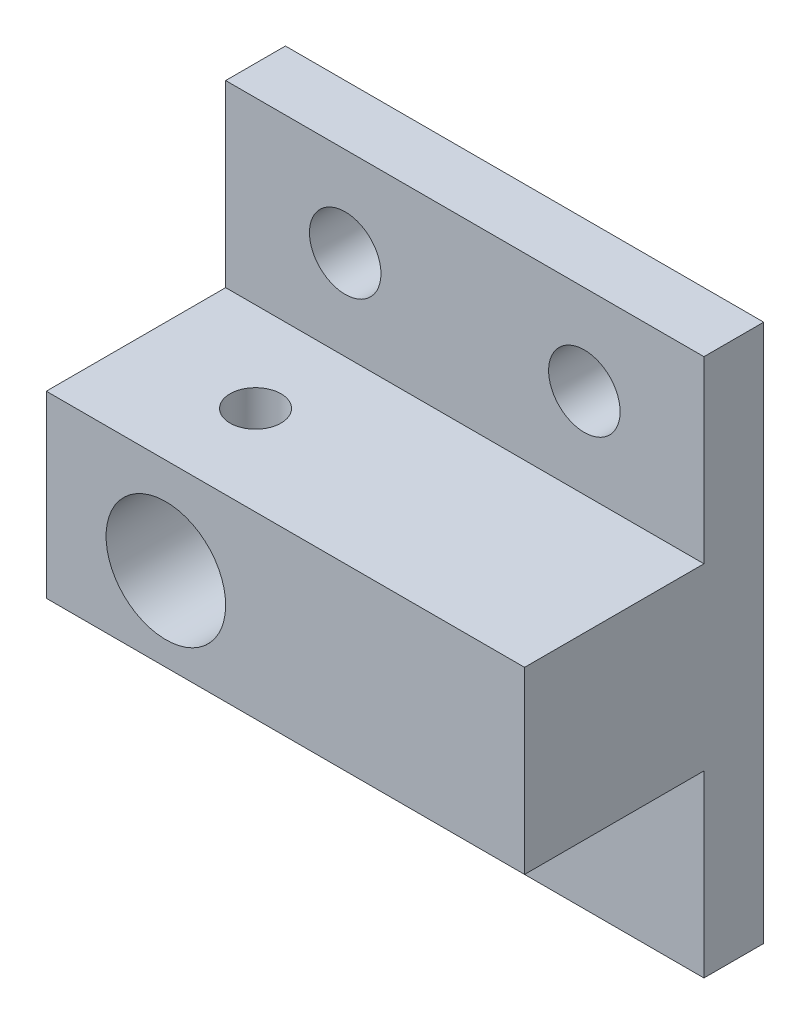
ISO-10303-21;
HEADER;
FILE_DESCRIPTION(('STEP AP214'),'2;1');
FILE_NAME('part.step','',(''),(''),'','','');
FILE_SCHEMA(('AUTOMOTIVE_DESIGN { 1 0 10303 214 1 1 1 1 }'));
ENDSEC;
DATA;
#1=APPLICATION_CONTEXT('core data for automotive mechanical design processes');
#2=APPLICATION_PROTOCOL_DEFINITION('international standard','automotive_design',2000,#1);
#3=PRODUCT_CONTEXT('',#1,'mechanical');
#4=PRODUCT('Part','Part','',(#3));
#5=PRODUCT_RELATED_PRODUCT_CATEGORY('part','',(#4));
#6=PRODUCT_DEFINITION_FORMATION('','',#4);
#7=PRODUCT_DEFINITION_CONTEXT('part definition',#1,'design');
#8=PRODUCT_DEFINITION('design','',#6,#7);
#9=PRODUCT_DEFINITION_SHAPE('','',#8);
#10=(LENGTH_UNIT() NAMED_UNIT(*) SI_UNIT(.MILLI.,.METRE.));
#11=(NAMED_UNIT(*) PLANE_ANGLE_UNIT() SI_UNIT($,.RADIAN.));
#12=(NAMED_UNIT(*) SI_UNIT($,.STERADIAN.) SOLID_ANGLE_UNIT());
#13=UNCERTAINTY_MEASURE_WITH_UNIT(LENGTH_MEASURE(1.E-05),#10,'distance_accuracy_value','');
#14=(GEOMETRIC_REPRESENTATION_CONTEXT(3) GLOBAL_UNCERTAINTY_ASSIGNED_CONTEXT((#13)) GLOBAL_UNIT_ASSIGNED_CONTEXT((#10,
#11,#12)) REPRESENTATION_CONTEXT('',''));
#15=CARTESIAN_POINT('',(0.,0.,0.));
#16=DIRECTION('',(0.,0.,1.));
#17=DIRECTION('',(1.,0.,0.));
#18=AXIS2_PLACEMENT_3D('',#15,#16,#17);
#19=CARTESIAN_POINT('',(12.7,-14.2874999999999,12.7));
#20=DIRECTION('',(-1.,0.,0.));
#21=DIRECTION('',(0.,0.,1.));
#22=AXIS2_PLACEMENT_3D('',#19,#20,#21);
#23=PLANE('',#22);
#24=DIRECTION('',(0.,0.,1.));
#25=VECTOR('',#24,1.);
#26=CARTESIAN_POINT('',(12.7,-4.7625,3.17499999999998));
#27=LINE('',#26,#25);
#28=CARTESIAN_POINT('',(12.7,-4.7625,3.17499999999998));
#29=VERTEX_POINT('',#28);
#30=CARTESIAN_POINT('',(12.7,-4.76249999999989,12.7));
#31=VERTEX_POINT('',#30);
#32=EDGE_CURVE('E60',#29,#31,#27,.T.);
#33=ORIENTED_EDGE('',*,*,#32,.F.);
#34=DIRECTION('',(0.,1.,0.));
#35=VECTOR('',#34,1.);
#36=CARTESIAN_POINT('',(12.7,0.,3.17500000000001));
#37=LINE('',#36,#35);
#38=CARTESIAN_POINT('',(12.7,-14.2875,3.17499999999998));
#39=VERTEX_POINT('',#38);
#40=EDGE_CURVE('E110',#39,#29,#37,.T.);
#41=ORIENTED_EDGE('',*,*,#40,.F.);
#42=DIRECTION('',(0.,0.,-1.));
#43=VECTOR('',#42,1.);
#44=CARTESIAN_POINT('',(12.7,-14.2874999999999,12.7));
#45=LINE('',#44,#43);
#46=CARTESIAN_POINT('',(12.7,-14.2875,0.));
#47=VERTEX_POINT('',#46);
#48=EDGE_CURVE('E155',#39,#47,#45,.T.);
#49=ORIENTED_EDGE('',*,*,#48,.T.);
#50=DIRECTION('',(0.,1.,0.));
#51=VECTOR('',#50,1.);
#52=CARTESIAN_POINT('',(12.7,-14.2875,0.));
#53=LINE('',#52,#51);
#54=CARTESIAN_POINT('',(12.7,14.2875,0.));
#55=VERTEX_POINT('',#54);
#56=EDGE_CURVE('E130',#47,#55,#53,.T.);
#57=ORIENTED_EDGE('',*,*,#56,.T.);
#58=DIRECTION('',(0.,0.,-1.));
#59=VECTOR('',#58,1.);
#60=CARTESIAN_POINT('',(12.7,14.2875000000001,12.7));
#61=LINE('',#60,#59);
#62=CARTESIAN_POINT('',(12.7,14.2875,3.17500000000001));
#63=VERTEX_POINT('',#62);
#64=EDGE_CURVE('E11',#63,#55,#61,.T.);
#65=ORIENTED_EDGE('',*,*,#64,.F.);
#66=DIRECTION('',(0.,1.,0.));
#67=VECTOR('',#66,1.);
#68=CARTESIAN_POINT('',(12.7,4.7625,3.17500000000001));
#69=LINE('',#68,#67);
#70=CARTESIAN_POINT('',(12.7,4.7625,3.17500000000001));
#71=VERTEX_POINT('',#70);
#72=EDGE_CURVE('E142',#71,#63,#69,.T.);
#73=ORIENTED_EDGE('',*,*,#72,.F.);
#74=DIRECTION('',(0.,0.,1.));
#75=VECTOR('',#74,1.);
#76=CARTESIAN_POINT('',(12.7,4.7625,3.17500000000001));
#77=LINE('',#76,#75);
#78=CARTESIAN_POINT('',(12.7,4.76250000000009,12.7));
#79=VERTEX_POINT('',#78);
#80=EDGE_CURVE('E132',#71,#79,#77,.T.);
#81=ORIENTED_EDGE('',*,*,#80,.T.);
#82=DIRECTION('',(0.,1.,0.));
#83=VECTOR('',#82,1.);
#84=CARTESIAN_POINT('',(12.7,-14.2874999999999,12.7));
#85=LINE('',#84,#83);
#86=EDGE_CURVE('E149',#31,#79,#85,.T.);
#87=ORIENTED_EDGE('',*,*,#86,.F.);
#88=EDGE_LOOP('',(#33,#41,#49,#57,#65,#73,#81,#87));
#89=FACE_BOUND('',#88,.T.);
#90=ADVANCED_FACE('F38',(#89),#23,.F.);
#91=CARTESIAN_POINT('',(-12.7,-14.2875,12.7));
#92=DIRECTION('',(1.,0.,0.));
#93=DIRECTION('',(0.,0.,-1.));
#94=AXIS2_PLACEMENT_3D('',#91,#92,#93);
#95=PLANE('',#94);
#96=DIRECTION('',(0.,0.,1.));
#97=VECTOR('',#96,1.);
#98=CARTESIAN_POINT('',(-12.7,-4.7625,3.17499999999998));
#99=LINE('',#98,#97);
#100=CARTESIAN_POINT('',(-12.7,-4.7625,3.17499999999998));
#101=VERTEX_POINT('',#100);
#102=CARTESIAN_POINT('',(-12.7,-4.7625,12.7));
#103=VERTEX_POINT('',#102);
#104=EDGE_CURVE('E100',#101,#103,#99,.T.);
#105=ORIENTED_EDGE('',*,*,#104,.T.);
#106=DIRECTION('',(0.,-1.,0.));
#107=VECTOR('',#106,1.);
#108=CARTESIAN_POINT('',(-12.7,-14.2875,12.7));
#109=LINE('',#108,#107);
#110=CARTESIAN_POINT('',(-12.7,4.7625,12.7));
#111=VERTEX_POINT('',#110);
#112=EDGE_CURVE('E152',#111,#103,#109,.T.);
#113=ORIENTED_EDGE('',*,*,#112,.F.);
#114=DIRECTION('',(0.,0.,1.));
#115=VECTOR('',#114,1.);
#116=CARTESIAN_POINT('',(-12.7,4.7625,3.17500000000001));
#117=LINE('',#116,#115);
#118=CARTESIAN_POINT('',(-12.7,4.7625,3.17500000000001));
#119=VERTEX_POINT('',#118);
#120=EDGE_CURVE('E52',#119,#111,#117,.T.);
#121=ORIENTED_EDGE('',*,*,#120,.F.);
#122=DIRECTION('',(0.,1.,0.));
#123=VECTOR('',#122,1.);
#124=CARTESIAN_POINT('',(-12.7,4.7625,3.17500000000001));
#125=LINE('',#124,#123);
#126=CARTESIAN_POINT('',(-12.7,14.2875,3.17500000000001));
#127=VERTEX_POINT('',#126);
#128=EDGE_CURVE('E139',#119,#127,#125,.T.);
#129=ORIENTED_EDGE('',*,*,#128,.T.);
#130=DIRECTION('',(0.,0.,-1.));
#131=VECTOR('',#130,1.);
#132=CARTESIAN_POINT('',(-12.7,14.2875,12.7));
#133=LINE('',#132,#131);
#134=CARTESIAN_POINT('',(-12.7,14.2874999999999,0.));
#135=VERTEX_POINT('',#134);
#136=EDGE_CURVE('E45',#127,#135,#133,.T.);
#137=ORIENTED_EDGE('',*,*,#136,.T.);
#138=DIRECTION('',(0.,-1.,0.));
#139=VECTOR('',#138,1.);
#140=CARTESIAN_POINT('',(-12.7,-14.2875000000001,0.));
#141=LINE('',#140,#139);
#142=CARTESIAN_POINT('',(-12.7,-14.2875000000001,0.));
#143=VERTEX_POINT('',#142);
#144=EDGE_CURVE('E161',#135,#143,#141,.T.);
#145=ORIENTED_EDGE('',*,*,#144,.T.);
#146=DIRECTION('',(0.,0.,-1.));
#147=VECTOR('',#146,1.);
#148=CARTESIAN_POINT('',(-12.7,-14.2875,12.7));
#149=LINE('',#148,#147);
#150=CARTESIAN_POINT('',(-12.7,-14.2875,3.17499999999998));
#151=VERTEX_POINT('',#150);
#152=EDGE_CURVE('E121',#151,#143,#149,.T.);
#153=ORIENTED_EDGE('',*,*,#152,.F.);
#154=DIRECTION('',(0.,-1.,0.));
#155=VECTOR('',#154,1.);
#156=CARTESIAN_POINT('',(-12.7,0.,3.17500000000001));
#157=LINE('',#156,#155);
#158=EDGE_CURVE('E114',#101,#151,#157,.T.);
#159=ORIENTED_EDGE('',*,*,#158,.F.);
#160=EDGE_LOOP('',(#105,#113,#121,#129,#137,#145,#153,#159));
#161=FACE_BOUND('',#160,.T.);
#162=ADVANCED_FACE('F119',(#161),#95,.F.);
#163=CARTESIAN_POINT('',(-12.7,-14.2875,12.7));
#164=DIRECTION('',(0.,1.,0.));
#165=DIRECTION('',(0.,0.,1.));
#166=AXIS2_PLACEMENT_3D('',#163,#164,#165);
#167=PLANE('',#166);
#168=DIRECTION('',(1.,0.,0.));
#169=VECTOR('',#168,1.);
#170=CARTESIAN_POINT('',(0.,-14.2875,3.17499999999998));
#171=LINE('',#170,#169);
#172=EDGE_CURVE('E122',#151,#39,#171,.T.);
#173=ORIENTED_EDGE('',*,*,#172,.F.);
#174=ORIENTED_EDGE('',*,*,#152,.T.);
#175=DIRECTION('',(1.,0.,0.));
#176=VECTOR('',#175,1.);
#177=CARTESIAN_POINT('',(-12.7,-14.2875000000001,0.));
#178=LINE('',#177,#176);
#179=EDGE_CURVE('E153',#143,#47,#178,.T.);
#180=ORIENTED_EDGE('',*,*,#179,.T.);
#181=ORIENTED_EDGE('',*,*,#48,.F.);
#182=EDGE_LOOP('',(#173,#174,#180,#181));
#183=FACE_BOUND('',#182,.T.);
#184=ADVANCED_FACE('F178',(#183),#167,.F.);
#185=CARTESIAN_POINT('',(0.,1.11022302462516E-13,12.7));
#186=DIRECTION('',(0.,0.,-1.));
#187=DIRECTION('',(-1.,0.,0.));
#188=AXIS2_PLACEMENT_3D('',#185,#186,#187);
#189=PLANE('',#188);
#190=CARTESIAN_POINT('',(-6.35,-0.317499999999998,12.7));
#191=DIRECTION('',(0.,0.,1.));
#192=DIRECTION('',(1.,0.,0.));
#193=AXIS2_PLACEMENT_3D('',#190,#191,#192);
#194=CIRCLE('',#193,3.175);
#195=CARTESIAN_POINT('',(-3.175,-0.317499999999998,12.7));
#196=VERTEX_POINT('',#195);
#197=EDGE_CURVE('E221',#196,#196,#194,.T.);
#198=ORIENTED_EDGE('',*,*,#197,.F.);
#199=EDGE_LOOP('',(#198));
#200=FACE_BOUND('',#199,.T.);
#201=DIRECTION('',(1.,0.,0.));
#202=VECTOR('',#201,1.);
#203=CARTESIAN_POINT('',(0.,-4.76249999999989,12.7));
#204=LINE('',#203,#202);
#205=EDGE_CURVE('E105',#103,#31,#204,.T.);
#206=ORIENTED_EDGE('',*,*,#205,.T.);
#207=ORIENTED_EDGE('',*,*,#86,.T.);
#208=DIRECTION('',(1.,0.,0.));
#209=VECTOR('',#208,1.);
#210=CARTESIAN_POINT('',(-12.7,4.7625,12.7));
#211=LINE('',#210,#209);
#212=EDGE_CURVE('E129',#111,#79,#211,.T.);
#213=ORIENTED_EDGE('',*,*,#212,.F.);
#214=ORIENTED_EDGE('',*,*,#112,.T.);
#215=EDGE_LOOP('',(#206,#207,#213,#214));
#216=FACE_BOUND('',#215,.T.);
#217=ADVANCED_FACE('F183',(#200,#216),#189,.F.);
#218=CARTESIAN_POINT('',(-12.7,14.2875,12.7));
#219=DIRECTION('',(0.,-1.,0.));
#220=DIRECTION('',(0.,0.,-1.));
#221=AXIS2_PLACEMENT_3D('',#218,#219,#220);
#222=PLANE('',#221);
#223=ORIENTED_EDGE('',*,*,#136,.F.);
#224=DIRECTION('',(1.,0.,0.));
#225=VECTOR('',#224,1.);
#226=CARTESIAN_POINT('',(-12.7,14.2875,3.17500000000001));
#227=LINE('',#226,#225);
#228=EDGE_CURVE('E144',#127,#63,#227,.T.);
#229=ORIENTED_EDGE('',*,*,#228,.T.);
#230=ORIENTED_EDGE('',*,*,#64,.T.);
#231=DIRECTION('',(-1.,0.,0.));
#232=VECTOR('',#231,1.);
#233=CARTESIAN_POINT('',(-12.7,14.2874999999999,0.));
#234=LINE('',#233,#232);
#235=EDGE_CURVE('E158',#55,#135,#234,.T.);
#236=ORIENTED_EDGE('',*,*,#235,.T.);
#237=EDGE_LOOP('',(#223,#229,#230,#236));
#238=FACE_BOUND('',#237,.T.);
#239=ADVANCED_FACE('F171',(#238),#222,.F.);
#240=CARTESIAN_POINT('',(0.,0.,0.));
#241=DIRECTION('',(0.,0.,-1.));
#242=DIRECTION('',(-1.,0.,0.));
#243=AXIS2_PLACEMENT_3D('',#240,#241,#242);
#244=PLANE('',#243);
#245=CARTESIAN_POINT('',(-6.34999999999999,9.52500000000001,0.));
#246=DIRECTION('',(0.,0.,-1.));
#247=DIRECTION('',(-1.,0.,0.));
#248=AXIS2_PLACEMENT_3D('',#245,#246,#247);
#249=CIRCLE('',#248,1.89865);
#250=CARTESIAN_POINT('',(-8.24864999999999,9.52500000000001,0.));
#251=VERTEX_POINT('',#250);
#252=EDGE_CURVE('E262',#251,#251,#249,.T.);
#253=ORIENTED_EDGE('',*,*,#252,.F.);
#254=EDGE_LOOP('',(#253));
#255=FACE_BOUND('',#254,.T.);
#256=CARTESIAN_POINT('',(6.35000000000001,9.5249999999999,0.));
#257=DIRECTION('',(0.,0.,-1.));
#258=DIRECTION('',(-1.,0.,0.));
#259=AXIS2_PLACEMENT_3D('',#256,#257,#258);
#260=CIRCLE('',#259,1.89865);
#261=CARTESIAN_POINT('',(4.45135000000001,9.5249999999999,0.));
#262=VERTEX_POINT('',#261);
#263=EDGE_CURVE('E266',#262,#262,#260,.T.);
#264=ORIENTED_EDGE('',*,*,#263,.F.);
#265=EDGE_LOOP('',(#264));
#266=FACE_BOUND('',#265,.T.);
#267=CARTESIAN_POINT('',(-6.35,-8.57250000000001,1.11022302462516E-13));
#268=DIRECTION('',(0.,0.,-1.));
#269=DIRECTION('',(-1.,0.,0.));
#270=AXIS2_PLACEMENT_3D('',#267,#268,#269);
#271=CIRCLE('',#270,1.89865);
#272=CARTESIAN_POINT('',(-8.24865,-8.57250000000001,1.11022302462516E-13));
#273=VERTEX_POINT('',#272);
#274=EDGE_CURVE('E274',#273,#273,#271,.T.);
#275=ORIENTED_EDGE('',*,*,#274,.F.);
#276=EDGE_LOOP('',(#275));
#277=FACE_BOUND('',#276,.T.);
#278=CARTESIAN_POINT('',(-6.35,-0.317499999999998,0.));
#279=DIRECTION('',(0.,0.,1.));
#280=DIRECTION('',(1.,0.,0.));
#281=AXIS2_PLACEMENT_3D('',#278,#279,#280);
#282=CIRCLE('',#281,3.175);
#283=CARTESIAN_POINT('',(-3.175,-0.317499999999998,0.));
#284=VERTEX_POINT('',#283);
#285=EDGE_CURVE('E135',#284,#284,#282,.T.);
#286=ORIENTED_EDGE('',*,*,#285,.T.);
#287=EDGE_LOOP('',(#286));
#288=FACE_BOUND('',#287,.T.);
#289=ORIENTED_EDGE('',*,*,#56,.F.);
#290=ORIENTED_EDGE('',*,*,#179,.F.);
#291=ORIENTED_EDGE('',*,*,#144,.F.);
#292=ORIENTED_EDGE('',*,*,#235,.F.);
#293=EDGE_LOOP('',(#289,#290,#291,#292));
#294=FACE_BOUND('',#293,.T.);
#295=ADVANCED_FACE('F175',(#255,#266,#277,#288,#294),#244,.T.);
#296=CARTESIAN_POINT('',(-12.7,4.7625,3.17500000000001));
#297=DIRECTION('',(0.,-1.,0.));
#298=DIRECTION('',(0.,0.,-1.));
#299=AXIS2_PLACEMENT_3D('',#296,#297,#298);
#300=PLANE('',#299);
#301=CARTESIAN_POINT('',(-6.34999999999997,4.7625,7.93750000000001));
#302=DIRECTION('',(0.,1.,0.));
#303=DIRECTION('',(0.,0.,1.));
#304=AXIS2_PLACEMENT_3D('',#301,#302,#303);
#305=CIRCLE('',#304,1.35255);
#306=CARTESIAN_POINT('',(-6.34999999999997,4.7625,9.29005000000001));
#307=VERTEX_POINT('',#306);
#308=EDGE_CURVE('E227',#307,#307,#305,.T.);
#309=ORIENTED_EDGE('',*,*,#308,.F.);
#310=EDGE_LOOP('',(#309));
#311=FACE_BOUND('',#310,.T.);
#312=ORIENTED_EDGE('',*,*,#212,.T.);
#313=ORIENTED_EDGE('',*,*,#80,.F.);
#314=DIRECTION('',(1.,0.,0.));
#315=VECTOR('',#314,1.);
#316=CARTESIAN_POINT('',(-12.7,4.7625,3.17500000000001));
#317=LINE('',#316,#315);
#318=EDGE_CURVE('E137',#119,#71,#317,.T.);
#319=ORIENTED_EDGE('',*,*,#318,.F.);
#320=ORIENTED_EDGE('',*,*,#120,.T.);
#321=EDGE_LOOP('',(#312,#313,#319,#320));
#322=FACE_BOUND('',#321,.T.);
#323=ADVANCED_FACE('F184',(#311,#322),#300,.F.);
#324=CARTESIAN_POINT('',(0.,0.,3.17500000000001));
#325=DIRECTION('',(0.,0.,-1.));
#326=DIRECTION('',(-1.,0.,0.));
#327=AXIS2_PLACEMENT_3D('',#324,#325,#326);
#328=PLANE('',#327);
#329=CARTESIAN_POINT('',(-6.34999999999999,9.52500000000001,3.17499999999998));
#330=DIRECTION('',(0.,0.,1.));
#331=DIRECTION('',(1.,0.,0.));
#332=AXIS2_PLACEMENT_3D('',#329,#330,#331);
#333=CIRCLE('',#332,1.89865);
#334=CARTESIAN_POINT('',(-4.45135,9.52500000000001,3.17499999999998));
#335=VERTEX_POINT('',#334);
#336=EDGE_CURVE('E259',#335,#335,#333,.T.);
#337=ORIENTED_EDGE('',*,*,#336,.F.);
#338=EDGE_LOOP('',(#337));
#339=FACE_BOUND('',#338,.T.);
#340=CARTESIAN_POINT('',(6.35000000000001,9.52500000000001,3.17499999999998));
#341=DIRECTION('',(0.,0.,1.));
#342=DIRECTION('',(1.,0.,0.));
#343=AXIS2_PLACEMENT_3D('',#340,#341,#342);
#344=CIRCLE('',#343,1.89865);
#345=CARTESIAN_POINT('',(8.24865000000001,9.52500000000001,3.17499999999998));
#346=VERTEX_POINT('',#345);
#347=EDGE_CURVE('E263',#346,#346,#344,.T.);
#348=ORIENTED_EDGE('',*,*,#347,.F.);
#349=EDGE_LOOP('',(#348));
#350=FACE_BOUND('',#349,.T.);
#351=ORIENTED_EDGE('',*,*,#128,.F.);
#352=ORIENTED_EDGE('',*,*,#318,.T.);
#353=ORIENTED_EDGE('',*,*,#72,.T.);
#354=ORIENTED_EDGE('',*,*,#228,.F.);
#355=EDGE_LOOP('',(#351,#352,#353,#354));
#356=FACE_BOUND('',#355,.T.);
#357=ADVANCED_FACE('F186',(#339,#350,#356),#328,.F.);
#358=CARTESIAN_POINT('',(0.,-4.76249999999998,3.17499999999998));
#359=DIRECTION('',(0.,-1.,0.));
#360=DIRECTION('',(0.,0.,-1.));
#361=AXIS2_PLACEMENT_3D('',#358,#359,#360);
#362=PLANE('',#361);
#363=ORIENTED_EDGE('',*,*,#205,.F.);
#364=ORIENTED_EDGE('',*,*,#104,.F.);
#365=DIRECTION('',(1.,0.,0.));
#366=VECTOR('',#365,1.);
#367=CARTESIAN_POINT('',(0.,-4.76249999999998,3.17499999999998));
#368=LINE('',#367,#366);
#369=EDGE_CURVE('E103',#101,#29,#368,.T.);
#370=ORIENTED_EDGE('',*,*,#369,.T.);
#371=ORIENTED_EDGE('',*,*,#32,.T.);
#372=EDGE_LOOP('',(#363,#364,#370,#371));
#373=FACE_BOUND('',#372,.T.);
#374=ADVANCED_FACE('F102',(#373),#362,.T.);
#375=CARTESIAN_POINT('',(0.,0.,3.17500000000001));
#376=DIRECTION('',(0.,0.,1.));
#377=DIRECTION('',(1.,0.,0.));
#378=AXIS2_PLACEMENT_3D('',#375,#376,#377);
#379=PLANE('',#378);
#380=CARTESIAN_POINT('',(-6.35,-8.57250000000001,3.17500000000009));
#381=DIRECTION('',(0.,0.,1.));
#382=DIRECTION('',(1.,0.,0.));
#383=AXIS2_PLACEMENT_3D('',#380,#381,#382);
#384=CIRCLE('',#383,1.89865);
#385=CARTESIAN_POINT('',(-4.45135,-8.57250000000001,3.17500000000009));
#386=VERTEX_POINT('',#385);
#387=EDGE_CURVE('E272',#386,#386,#384,.T.);
#388=ORIENTED_EDGE('',*,*,#387,.F.);
#389=EDGE_LOOP('',(#388));
#390=FACE_BOUND('',#389,.T.);
#391=ORIENTED_EDGE('',*,*,#369,.F.);
#392=ORIENTED_EDGE('',*,*,#158,.T.);
#393=ORIENTED_EDGE('',*,*,#172,.T.);
#394=ORIENTED_EDGE('',*,*,#40,.T.);
#395=EDGE_LOOP('',(#391,#392,#393,#394));
#396=FACE_BOUND('',#395,.T.);
#397=ADVANCED_FACE('F113',(#390,#396),#379,.T.);
#398=CARTESIAN_POINT('',(-6.35,-0.317499999999998,0.));
#399=DIRECTION('',(0.,0.,1.));
#400=DIRECTION('',(1.,0.,0.));
#401=AXIS2_PLACEMENT_3D('',#398,#399,#400);
#402=CYLINDRICAL_SURFACE('',#401,3.175);
#403=CARTESIAN_POINT('',(-6.35,2.85749999999998,9.29004999999999));
#404=CARTESIAN_POINT('',(-6.2776880196817,2.85749376427409,9.29004177520316));
#405=CARTESIAN_POINT('',(-6.20526964403055,2.85500122265995,9.28421677085278));
#406=CARTESIAN_POINT('',(-6.06249174693068,2.84527066799621,9.26112700946329));
#407=CARTESIAN_POINT('',(-5.99213793884274,2.83802058505162,9.24383315473187));
#408=CARTESIAN_POINT('',(-5.85579106007763,2.81955242394935,9.19856652134824));
#409=CARTESIAN_POINT('',(-5.78978385831355,2.80834804282755,9.17063057893923));
#410=CARTESIAN_POINT('',(-5.66345919236297,2.7830551810215,9.1050283132911));
#411=CARTESIAN_POINT('',(-5.60314015362967,2.76896750190969,9.06736469363827));
#412=CARTESIAN_POINT('',(-5.48666937844645,2.73849084668586,8.98131052235011));
#413=CARTESIAN_POINT('',(-5.43085195700623,2.72202431771543,8.93249522263458));
#414=CARTESIAN_POINT('',(-5.32790620026015,2.68897271455962,8.82642253623827));
#415=CARTESIAN_POINT('',(-5.28078263404611,2.67238758046312,8.76916054685898));
#416=CARTESIAN_POINT('',(-5.19413811349596,2.64000917471473,8.6442161457185));
#417=CARTESIAN_POINT('',(-5.15513955123329,2.62430185247631,8.57614683913289));
#418=CARTESIAN_POINT('',(-5.08929500211611,2.59669493098837,8.43365021576442));
#419=CARTESIAN_POINT('',(-5.0624424762224,2.58479328389849,8.35922634579415));
#420=CARTESIAN_POINT('',(-5.02304862826764,2.56698854081884,8.20998178209825));
#421=CARTESIAN_POINT('',(-5.00986233419172,2.56081670118835,8.13536466649273));
#422=CARTESIAN_POINT('',(-4.9961649433191,2.5544016392898,7.98474141107699));
#423=CARTESIAN_POINT('',(-4.99564639272637,2.55415493063134,7.90873611443426));
#424=CARTESIAN_POINT('',(-5.00681504117493,2.55939162283199,7.76405646216194));
#425=CARTESIAN_POINT('',(-5.01751912807758,2.56441351336425,7.69528608927003));
#426=CARTESIAN_POINT('',(-5.04917451179533,2.57883861211707,7.56063102087288));
#427=CARTESIAN_POINT('',(-5.07012787776667,2.58824270501209,7.49474691098289));
#428=CARTESIAN_POINT('',(-5.12209912631627,2.61058748949866,7.3660327224331));
#429=CARTESIAN_POINT('',(-5.15332567811173,2.62360054344015,7.30330002824037));
#430=CARTESIAN_POINT('',(-5.22480862191111,2.65168199373291,7.18371377419414));
#431=CARTESIAN_POINT('',(-5.26506866231792,2.66675121955486,7.12686260333506));
#432=CARTESIAN_POINT('',(-5.3576660500718,2.69887253593643,7.01534411343624));
#433=CARTESIAN_POINT('',(-5.41075800496066,2.71598193205179,6.96131804789814));
#434=CARTESIAN_POINT('',(-5.52541016083482,2.74913259637418,6.86271552840121));
#435=CARTESIAN_POINT('',(-5.58697252093185,2.76517359069275,6.81814149115567));
#436=CARTESIAN_POINT('',(-5.71884200139585,2.79488486879188,6.73870918261835));
#437=CARTESIAN_POINT('',(-5.78932993543954,2.80848548270222,6.70412308137787));
#438=CARTESIAN_POINT('',(-5.9358514030737,2.83124388156016,6.64752704250684));
#439=CARTESIAN_POINT('',(-6.01188170055456,2.84040423558692,6.62550983135905));
#440=CARTESIAN_POINT('',(-6.1619805476647,2.85276332558041,6.59604491934093));
#441=CARTESIAN_POINT('',(-6.23585138213035,2.85631325962292,6.58773734469851));
#442=CARTESIAN_POINT('',(-6.38401142821482,2.85818105366636,6.58334992680006));
#443=CARTESIAN_POINT('',(-6.45830050585429,2.85650050350426,6.58726636798233));
#444=CARTESIAN_POINT('',(-6.60108636594545,2.84832243599864,6.60661043997586));
#445=CARTESIAN_POINT('',(-6.669682718417,2.84208185757468,6.62142433271251));
#446=CARTESIAN_POINT('',(-6.8033351152465,2.82569082038793,6.66127756726437));
#447=CARTESIAN_POINT('',(-6.86839071638275,2.81553987341454,6.68631818591263));
#448=CARTESIAN_POINT('',(-6.995410792119,2.79190117061925,6.74672832667113));
#449=CARTESIAN_POINT('',(-7.05721545937044,2.7783191739096,6.7823957797454));
#450=CARTESIAN_POINT('',(-7.17418487979478,2.74925439613932,6.86272103608396));
#451=CARTESIAN_POINT('',(-7.22934679469044,2.73377080824472,6.90738266069994));
#452=CARTESIAN_POINT('',(-7.33579077872458,2.70113676563667,7.00831760274853));
#453=CARTESIAN_POINT('',(-7.38647723077647,2.68394808863403,7.0652082744472));
#454=CARTESIAN_POINT('',(-7.47776122684813,2.65085692538156,7.18694302368869));
#455=CARTESIAN_POINT('',(-7.51835608123138,2.63495478278206,7.25178921469235));
#456=CARTESIAN_POINT('',(-7.58885812859457,2.6060830304592,7.38915757409287));
#457=CARTESIAN_POINT('',(-7.61857052110251,2.59316826625582,7.4617921173566));
#458=CARTESIAN_POINT('',(-7.6650792800295,2.57245701757536,7.61175935932628));
#459=CARTESIAN_POINT('',(-7.6818869503345,2.56465605454418,7.68908788211574));
#460=CARTESIAN_POINT('',(-7.70096216089002,2.55576066425676,7.8396089835159));
#461=CARTESIAN_POINT('',(-7.70428166989023,2.55418133184627,7.91264007908179));
#462=CARTESIAN_POINT('',(-7.69912066967991,2.55660980516822,8.05818163722144));
#463=CARTESIAN_POINT('',(-7.69064217966592,2.5606166548405,8.13069218675055));
#464=CARTESIAN_POINT('',(-7.66302255224126,2.57331435572085,8.26932444023977));
#465=CARTESIAN_POINT('',(-7.64444551613289,2.58175667251007,8.33558352632024));
#466=CARTESIAN_POINT('',(-7.59772175082132,2.60216810669132,8.46405240125548));
#467=CARTESIAN_POINT('',(-7.56957230769733,2.61413822413923,8.52626103578051));
#468=CARTESIAN_POINT('',(-7.50251036671548,2.64116974170815,8.64904945594292));
#469=CARTESIAN_POINT('',(-7.4630417786036,2.65637612153681,8.70929297640015));
#470=CARTESIAN_POINT('',(-7.37522167499384,2.68778179589941,8.82263050272944));
#471=CARTESIAN_POINT('',(-7.32686686026609,2.7039814577202,8.87572184044811));
#472=CARTESIAN_POINT('',(-7.2181998600487,2.73705722211624,8.97749082551858));
#473=CARTESIAN_POINT('',(-7.15725109614535,2.75388832065962,9.02550664347722));
#474=CARTESIAN_POINT('',(-7.02754703294768,2.78507916482519,9.1106745794027));
#475=CARTESIAN_POINT('',(-6.95878821250422,2.79943778833811,9.14782177006528));
#476=CARTESIAN_POINT('',(-6.81634924472016,2.82388312017245,9.2094446856494));
#477=CARTESIAN_POINT('',(-6.74275860183535,2.83403079407946,9.2341024781165));
#478=CARTESIAN_POINT('',(-6.59207828385415,2.84915584269733,9.2704503976972));
#479=CARTESIAN_POINT('',(-6.51500025748403,2.85414926980854,9.28218079369904));
#480=CARTESIAN_POINT('',(-6.40840132787681,2.85709936321146,9.28910755828298));
#481=CARTESIAN_POINT('',(-6.37920934385744,2.85750251882828,9.29005332228377));
#482=CARTESIAN_POINT('',(-6.35,2.85749999999998,9.29004999999999));
#483=B_SPLINE_CURVE_WITH_KNOTS('',3,(#403,#404,#405,#406,#407,#408,#409,#410,#411,#412,#413,
#414,#415,#416,#417,#418,#419,#420,#421,#422,#423,#424,#425,#426,#427,#428,#429,#430,#431,#432,
#433,#434,#435,#436,#437,#438,#439,#440,#441,#442,#443,#444,#445,#446,#447,#448,#449,#450,#451,
#452,#453,#454,#455,#456,#457,#458,#459,#460,#461,#462,#463,#464,#465,#466,#467,#468,#469,#470,
#471,#472,#473,#474,#475,#476,#477,#478,#479,#480,#481,#482),.UNSPECIFIED.,.T.,.F.,(4,2,2,2,2,2,
2,2,2,2,2,2,2,2,2,2,2,2,2,2,2,2,2,2,2,2,2,2,2,2,2,2,2,2,2,2,2,2,2,4),(0.,0.216850050638949,
0.434252388523425,0.650908954368247,0.867505370130756,1.09439609589244,1.32141091689533,
1.56022386511509,1.79890809057366,2.0257290264884,2.25241649603318,2.4607825128077,
2.66919061253208,2.88212426261056,3.09514406662223,3.3270632141617,3.55904158793935,
3.79684693152952,4.0345145191816,4.2566142658214,4.47864651050862,4.689048025276,
4.89947581724867,5.11647002970511,5.33355663169257,5.56682347195777,5.80015241655907,
6.03747459229681,6.27458864785549,6.49280702774583,6.71098806472675,6.9180749242495,
7.12522054501714,7.34512352029503,7.56510830550801,7.80215736760164,8.0393137302226,
8.27290548905712,8.50576753373726,8.59336087119996),.UNSPECIFIED.);
#484=CARTESIAN_POINT('',(-6.35,2.85749999999998,9.29004999999999));
#485=VERTEX_POINT('',#484);
#486=EDGE_CURVE('E223',#485,#485,#483,.T.);
#487=ORIENTED_EDGE('',*,*,#486,.T.);
#488=EDGE_LOOP('',(#487));
#489=FACE_BOUND('',#488,.T.);
#490=ORIENTED_EDGE('',*,*,#285,.F.);
#491=EDGE_LOOP('',(#490));
#492=FACE_BOUND('',#491,.T.);
#493=ORIENTED_EDGE('',*,*,#197,.T.);
#494=EDGE_LOOP('',(#493));
#495=FACE_BOUND('',#494,.T.);
#496=ADVANCED_FACE('F243',(#489,#492,#495),#402,.F.);
#497=CARTESIAN_POINT('',(-6.34999999999997,4.7625,7.93750000000001));
#498=DIRECTION('',(0.,1.,0.));
#499=DIRECTION('',(0.,0.,1.));
#500=AXIS2_PLACEMENT_3D('',#497,#498,#499);
#501=CYLINDRICAL_SURFACE('',#500,1.35255);
#502=ORIENTED_EDGE('',*,*,#486,.F.);
#503=EDGE_LOOP('',(#502));
#504=FACE_BOUND('',#503,.T.);
#505=ORIENTED_EDGE('',*,*,#308,.T.);
#506=EDGE_LOOP('',(#505));
#507=FACE_BOUND('',#506,.T.);
#508=ADVANCED_FACE('F238',(#504,#507),#501,.F.);
#509=CARTESIAN_POINT('',(-6.35,-8.57250000000001,3.17500000000009));
#510=DIRECTION('',(0.,0.,1.));
#511=DIRECTION('',(1.,0.,0.));
#512=AXIS2_PLACEMENT_3D('',#509,#510,#511);
#513=CYLINDRICAL_SURFACE('',#512,1.89865);
#514=ORIENTED_EDGE('',*,*,#387,.T.);
#515=EDGE_LOOP('',(#514));
#516=FACE_BOUND('',#515,.T.);
#517=ORIENTED_EDGE('',*,*,#274,.T.);
#518=EDGE_LOOP('',(#517));
#519=FACE_BOUND('',#518,.T.);
#520=ADVANCED_FACE('F242',(#516,#519),#513,.F.);
#521=CARTESIAN_POINT('',(6.35000000000001,9.52500000000001,3.17499999999998));
#522=DIRECTION('',(0.,0.,1.));
#523=DIRECTION('',(1.,0.,0.));
#524=AXIS2_PLACEMENT_3D('',#521,#522,#523);
#525=CYLINDRICAL_SURFACE('',#524,1.89865);
#526=ORIENTED_EDGE('',*,*,#347,.T.);
#527=EDGE_LOOP('',(#526));
#528=FACE_BOUND('',#527,.T.);
#529=ORIENTED_EDGE('',*,*,#263,.T.);
#530=EDGE_LOOP('',(#529));
#531=FACE_BOUND('',#530,.T.);
#532=ADVANCED_FACE('F247',(#528,#531),#525,.F.);
#533=CARTESIAN_POINT('',(-6.34999999999999,9.52500000000001,3.17499999999998));
#534=DIRECTION('',(0.,0.,1.));
#535=DIRECTION('',(1.,0.,0.));
#536=AXIS2_PLACEMENT_3D('',#533,#534,#535);
#537=CYLINDRICAL_SURFACE('',#536,1.89865);
#538=ORIENTED_EDGE('',*,*,#336,.T.);
#539=EDGE_LOOP('',(#538));
#540=FACE_BOUND('',#539,.T.);
#541=ORIENTED_EDGE('',*,*,#252,.T.);
#542=EDGE_LOOP('',(#541));
#543=FACE_BOUND('',#542,.T.);
#544=ADVANCED_FACE('F251',(#540,#543),#537,.F.);
#545=CLOSED_SHELL('',(#90,#162,#184,#217,#239,#295,#323,#357,#374,#397,#496,#508,#520,#532,#544));
#546=MANIFOLD_SOLID_BREP('B2',#545);
#547=ADVANCED_BREP_SHAPE_REPRESENTATION('',(#18,#546),#14);
#548=SHAPE_DEFINITION_REPRESENTATION(#9,#547);
ENDSEC;
END-ISO-10303-21;
